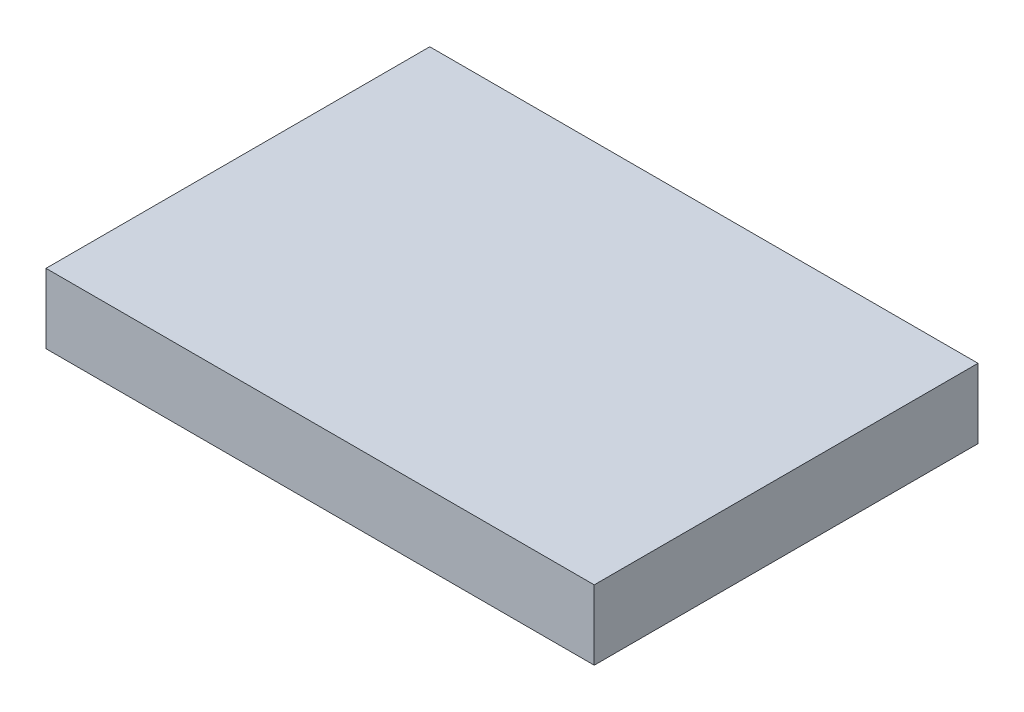
ISO-10303-21;
HEADER;
FILE_DESCRIPTION(('STEP AP214'),'2;1');
FILE_NAME('part.step','',(''),(''),'','','');
FILE_SCHEMA(('AUTOMOTIVE_DESIGN { 1 0 10303 214 1 1 1 1 }'));
ENDSEC;
DATA;
#1=APPLICATION_CONTEXT('core data for automotive mechanical design processes');
#2=APPLICATION_PROTOCOL_DEFINITION('international standard','automotive_design',2000,#1);
#3=PRODUCT_CONTEXT('',#1,'mechanical');
#4=PRODUCT('Part','Part','',(#3));
#5=PRODUCT_RELATED_PRODUCT_CATEGORY('part','',(#4));
#6=PRODUCT_DEFINITION_FORMATION('','',#4);
#7=PRODUCT_DEFINITION_CONTEXT('part definition',#1,'design');
#8=PRODUCT_DEFINITION('design','',#6,#7);
#9=PRODUCT_DEFINITION_SHAPE('','',#8);
#10=(LENGTH_UNIT() NAMED_UNIT(*) SI_UNIT(.MILLI.,.METRE.));
#11=(NAMED_UNIT(*) PLANE_ANGLE_UNIT() SI_UNIT($,.RADIAN.));
#12=(NAMED_UNIT(*) SI_UNIT($,.STERADIAN.) SOLID_ANGLE_UNIT());
#13=UNCERTAINTY_MEASURE_WITH_UNIT(LENGTH_MEASURE(1.E-05),#10,'distance_accuracy_value','');
#14=(GEOMETRIC_REPRESENTATION_CONTEXT(3) GLOBAL_UNCERTAINTY_ASSIGNED_CONTEXT((#13)) GLOBAL_UNIT_ASSIGNED_CONTEXT((#10,
#11,#12)) REPRESENTATION_CONTEXT('',''));
#15=CARTESIAN_POINT('',(0.,0.,0.));
#16=DIRECTION('',(0.,0.,1.));
#17=DIRECTION('',(1.,0.,0.));
#18=AXIS2_PLACEMENT_3D('',#15,#16,#17);
#19=CARTESIAN_POINT('',(5.00000016,-0.635,0.));
#20=DIRECTION('',(0.,-1.,0.));
#21=DIRECTION('',(0.,0.,-1.));
#22=AXIS2_PLACEMENT_3D('',#19,#20,#21);
#23=PLANE('',#22);
#24=DIRECTION('',(0.,0.,1.));
#25=VECTOR('',#24,1.);
#26=CARTESIAN_POINT('',(-5.00000016,-0.635,0.));
#27=LINE('',#26,#25);
#28=CARTESIAN_POINT('',(-5.00000016,-0.635,0.));
#29=VERTEX_POINT('',#28);
#30=CARTESIAN_POINT('',(-5.00000016,-0.635,6.9999987));
#31=VERTEX_POINT('',#30);
#32=EDGE_CURVE('E20',#29,#31,#27,.T.);
#33=ORIENTED_EDGE('',*,*,#32,.F.);
#34=DIRECTION('',(1.,0.,0.));
#35=VECTOR('',#34,1.);
#36=CARTESIAN_POINT('',(-5.00000016,-0.635,0.));
#37=LINE('',#36,#35);
#38=CARTESIAN_POINT('',(5.00000016,-0.635,0.));
#39=VERTEX_POINT('',#38);
#40=EDGE_CURVE('E79',#29,#39,#37,.T.);
#41=ORIENTED_EDGE('',*,*,#40,.T.);
#42=DIRECTION('',(0.,0.,-1.));
#43=VECTOR('',#42,1.);
#44=CARTESIAN_POINT('',(5.00000016,-0.635,0.));
#45=LINE('',#44,#43);
#46=CARTESIAN_POINT('',(5.00000016,-0.635,6.9999987));
#47=VERTEX_POINT('',#46);
#48=EDGE_CURVE('E61',#47,#39,#45,.T.);
#49=ORIENTED_EDGE('',*,*,#48,.F.);
#50=DIRECTION('',(1.,0.,0.));
#51=VECTOR('',#50,1.);
#52=CARTESIAN_POINT('',(-5.00000016,-0.635,6.9999987));
#53=LINE('',#52,#51);
#54=EDGE_CURVE('E56',#31,#47,#53,.T.);
#55=ORIENTED_EDGE('',*,*,#54,.F.);
#56=EDGE_LOOP('',(#33,#41,#49,#55));
#57=FACE_BOUND('',#56,.T.);
#58=ADVANCED_FACE('F17',(#57),#23,.T.);
#59=CARTESIAN_POINT('',(-5.00000016,-0.635,0.));
#60=DIRECTION('',(-1.,0.,0.));
#61=DIRECTION('',(0.,0.,1.));
#62=AXIS2_PLACEMENT_3D('',#59,#60,#61);
#63=PLANE('',#62);
#64=DIRECTION('',(0.,0.,1.));
#65=VECTOR('',#64,1.);
#66=CARTESIAN_POINT('',(-5.00000016,0.635,0.));
#67=LINE('',#66,#65);
#68=CARTESIAN_POINT('',(-5.00000016,0.635,0.));
#69=VERTEX_POINT('',#68);
#70=CARTESIAN_POINT('',(-5.00000016,0.635,6.9999987));
#71=VERTEX_POINT('',#70);
#72=EDGE_CURVE('E83',#69,#71,#67,.T.);
#73=ORIENTED_EDGE('',*,*,#72,.F.);
#74=DIRECTION('',(0.,1.,0.));
#75=VECTOR('',#74,1.);
#76=CARTESIAN_POINT('',(-5.00000016,-0.635,0.));
#77=LINE('',#76,#75);
#78=EDGE_CURVE('E68',#69,#29,#77,.F.);
#79=ORIENTED_EDGE('',*,*,#78,.T.);
#80=ORIENTED_EDGE('',*,*,#32,.T.);
#81=DIRECTION('',(0.,1.,0.));
#82=VECTOR('',#81,1.);
#83=CARTESIAN_POINT('',(-5.00000016,-0.635,6.9999987));
#84=LINE('',#83,#82);
#85=EDGE_CURVE('E63',#71,#31,#84,.F.);
#86=ORIENTED_EDGE('',*,*,#85,.F.);
#87=EDGE_LOOP('',(#73,#79,#80,#86));
#88=FACE_BOUND('',#87,.T.);
#89=ADVANCED_FACE('F65',(#88),#63,.T.);
#90=CARTESIAN_POINT('',(-5.00000016,-0.635,6.9999987));
#91=DIRECTION('',(0.,0.,1.));
#92=DIRECTION('',(1.,0.,0.));
#93=AXIS2_PLACEMENT_3D('',#90,#91,#92);
#94=PLANE('',#93);
#95=DIRECTION('',(1.,0.,0.));
#96=VECTOR('',#95,1.);
#97=CARTESIAN_POINT('',(-5.00000016,0.635,6.9999987));
#98=LINE('',#97,#96);
#99=CARTESIAN_POINT('',(5.00000016,0.635,6.9999987));
#100=VERTEX_POINT('',#99);
#101=EDGE_CURVE('E72',#71,#100,#98,.T.);
#102=ORIENTED_EDGE('',*,*,#101,.F.);
#103=ORIENTED_EDGE('',*,*,#85,.T.);
#104=ORIENTED_EDGE('',*,*,#54,.T.);
#105=DIRECTION('',(0.,1.,0.));
#106=VECTOR('',#105,1.);
#107=CARTESIAN_POINT('',(5.00000016,0.635,6.9999987));
#108=LINE('',#107,#106);
#109=EDGE_CURVE('E74',#100,#47,#108,.F.);
#110=ORIENTED_EDGE('',*,*,#109,.F.);
#111=EDGE_LOOP('',(#102,#103,#104,#110));
#112=FACE_BOUND('',#111,.T.);
#113=ADVANCED_FACE('F70',(#112),#94,.T.);
#114=CARTESIAN_POINT('',(5.00000016,0.635,0.));
#115=DIRECTION('',(1.,0.,0.));
#116=DIRECTION('',(0.,0.,-1.));
#117=AXIS2_PLACEMENT_3D('',#114,#115,#116);
#118=PLANE('',#117);
#119=ORIENTED_EDGE('',*,*,#48,.T.);
#120=DIRECTION('',(0.,1.,0.));
#121=VECTOR('',#120,1.);
#122=CARTESIAN_POINT('',(5.00000016,-0.635,0.));
#123=LINE('',#122,#121);
#124=CARTESIAN_POINT('',(5.00000016,0.635,0.));
#125=VERTEX_POINT('',#124);
#126=EDGE_CURVE('E35',#39,#125,#123,.T.);
#127=ORIENTED_EDGE('',*,*,#126,.T.);
#128=DIRECTION('',(0.,0.,1.));
#129=VECTOR('',#128,1.);
#130=CARTESIAN_POINT('',(5.00000016,0.635,0.));
#131=LINE('',#130,#129);
#132=EDGE_CURVE('E26',#100,#125,#131,.F.);
#133=ORIENTED_EDGE('',*,*,#132,.F.);
#134=ORIENTED_EDGE('',*,*,#109,.T.);
#135=EDGE_LOOP('',(#119,#127,#133,#134));
#136=FACE_BOUND('',#135,.T.);
#137=ADVANCED_FACE('F89',(#136),#118,.T.);
#138=CARTESIAN_POINT('',(-5.00000016,-0.635,0.));
#139=DIRECTION('',(0.,0.,1.));
#140=DIRECTION('',(1.,0.,0.));
#141=AXIS2_PLACEMENT_3D('',#138,#139,#140);
#142=PLANE('',#141);
#143=DIRECTION('',(1.,0.,0.));
#144=VECTOR('',#143,1.);
#145=CARTESIAN_POINT('',(-5.00000016,0.635,0.));
#146=LINE('',#145,#144);
#147=EDGE_CURVE('E11',#125,#69,#146,.F.);
#148=ORIENTED_EDGE('',*,*,#147,.F.);
#149=ORIENTED_EDGE('',*,*,#126,.F.);
#150=ORIENTED_EDGE('',*,*,#40,.F.);
#151=ORIENTED_EDGE('',*,*,#78,.F.);
#152=EDGE_LOOP('',(#148,#149,#150,#151));
#153=FACE_BOUND('',#152,.T.);
#154=ADVANCED_FACE('F91',(#153),#142,.F.);
#155=CARTESIAN_POINT('',(-5.00000016,0.635,0.));
#156=DIRECTION('',(0.,1.,0.));
#157=DIRECTION('',(0.,0.,1.));
#158=AXIS2_PLACEMENT_3D('',#155,#156,#157);
#159=PLANE('',#158);
#160=ORIENTED_EDGE('',*,*,#132,.T.);
#161=ORIENTED_EDGE('',*,*,#147,.T.);
#162=ORIENTED_EDGE('',*,*,#72,.T.);
#163=ORIENTED_EDGE('',*,*,#101,.T.);
#164=EDGE_LOOP('',(#160,#161,#162,#163));
#165=FACE_BOUND('',#164,.T.);
#166=ADVANCED_FACE('F88',(#165),#159,.T.);
#167=CLOSED_SHELL('',(#58,#89,#113,#137,#154,#166));
#168=MANIFOLD_SOLID_BREP('B1',#167);
#169=ADVANCED_BREP_SHAPE_REPRESENTATION('',(#18,#168),#14);
#170=SHAPE_DEFINITION_REPRESENTATION(#9,#169);
ENDSEC;
END-ISO-10303-21;
